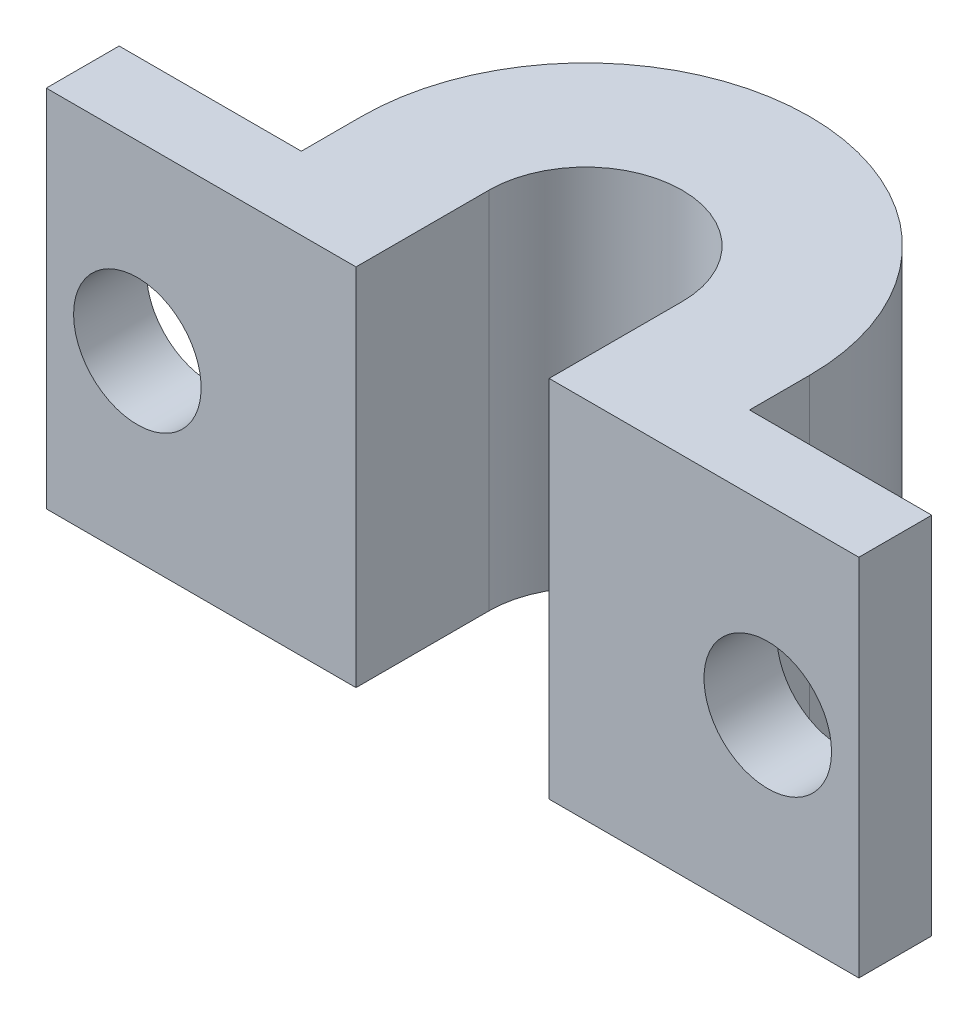
ISO-10303-21;
HEADER;
FILE_DESCRIPTION(('STEP AP214'),'2;1');
FILE_NAME('part.step','',(''),(''),'','','');
FILE_SCHEMA(('AUTOMOTIVE_DESIGN { 1 0 10303 214 1 1 1 1 }'));
ENDSEC;
DATA;
#1=APPLICATION_CONTEXT('core data for automotive mechanical design processes');
#2=APPLICATION_PROTOCOL_DEFINITION('international standard','automotive_design',2000,#1);
#3=PRODUCT_CONTEXT('',#1,'mechanical');
#4=PRODUCT('Part','Part','',(#3));
#5=PRODUCT_RELATED_PRODUCT_CATEGORY('part','',(#4));
#6=PRODUCT_DEFINITION_FORMATION('','',#4);
#7=PRODUCT_DEFINITION_CONTEXT('part definition',#1,'design');
#8=PRODUCT_DEFINITION('design','',#6,#7);
#9=PRODUCT_DEFINITION_SHAPE('','',#8);
#10=(LENGTH_UNIT() NAMED_UNIT(*) SI_UNIT(.MILLI.,.METRE.));
#11=(NAMED_UNIT(*) PLANE_ANGLE_UNIT() SI_UNIT($,.RADIAN.));
#12=(NAMED_UNIT(*) SI_UNIT($,.STERADIAN.) SOLID_ANGLE_UNIT());
#13=UNCERTAINTY_MEASURE_WITH_UNIT(LENGTH_MEASURE(1.E-05),#10,'distance_accuracy_value','');
#14=(GEOMETRIC_REPRESENTATION_CONTEXT(3) GLOBAL_UNCERTAINTY_ASSIGNED_CONTEXT((#13)) GLOBAL_UNIT_ASSIGNED_CONTEXT((#10,
#11,#12)) REPRESENTATION_CONTEXT('',''));
#15=CARTESIAN_POINT('',(0.,0.,0.));
#16=DIRECTION('',(0.,0.,1.));
#17=DIRECTION('',(1.,0.,0.));
#18=AXIS2_PLACEMENT_3D('',#15,#16,#17);
#19=CARTESIAN_POINT('',(6.15,10.,0.));
#20=DIRECTION('',(1.,0.,0.));
#21=DIRECTION('',(0.,0.,-1.));
#22=AXIS2_PLACEMENT_3D('',#19,#20,#21);
#23=PLANE('',#22);
#24=DIRECTION('',(0.,0.,1.));
#25=VECTOR('',#24,1.);
#26=CARTESIAN_POINT('',(6.15,0.,0.));
#27=LINE('',#26,#25);
#28=CARTESIAN_POINT('',(6.15,0.,0.));
#29=VERTEX_POINT('',#28);
#30=CARTESIAN_POINT('',(6.15,0.,1.65));
#31=VERTEX_POINT('',#30);
#32=EDGE_CURVE('E160',#29,#31,#27,.T.);
#33=ORIENTED_EDGE('',*,*,#32,.F.);
#34=DIRECTION('',(0.,-1.,0.));
#35=VECTOR('',#34,1.);
#36=CARTESIAN_POINT('',(6.15,10.,0.));
#37=LINE('',#36,#35);
#38=CARTESIAN_POINT('',(6.15,10.,0.));
#39=VERTEX_POINT('',#38);
#40=EDGE_CURVE('E11',#39,#29,#37,.T.);
#41=ORIENTED_EDGE('',*,*,#40,.F.);
#42=DIRECTION('',(0.,0.,1.));
#43=VECTOR('',#42,1.);
#44=CARTESIAN_POINT('',(6.15,10.,0.));
#45=LINE('',#44,#43);
#46=CARTESIAN_POINT('',(6.15,10.,1.65));
#47=VERTEX_POINT('',#46);
#48=EDGE_CURVE('E188',#39,#47,#45,.T.);
#49=ORIENTED_EDGE('',*,*,#48,.T.);
#50=DIRECTION('',(0.,-1.,0.));
#51=VECTOR('',#50,1.);
#52=CARTESIAN_POINT('',(6.15,10.,1.65));
#53=LINE('',#52,#51);
#54=EDGE_CURVE('E58',#47,#31,#53,.T.);
#55=ORIENTED_EDGE('',*,*,#54,.T.);
#56=EDGE_LOOP('',(#33,#41,#49,#55));
#57=FACE_BOUND('',#56,.T.);
#58=ADVANCED_FACE('F41',(#57),#23,.T.);
#59=CARTESIAN_POINT('',(0.,10.,0.));
#60=DIRECTION('',(0.,-1.,0.));
#61=DIRECTION('',(0.,0.,-1.));
#62=AXIS2_PLACEMENT_3D('',#59,#60,#61);
#63=CYLINDRICAL_SURFACE('',#62,6.15);
#64=CARTESIAN_POINT('',(0.,0.,0.));
#65=DIRECTION('',(0.,1.,0.));
#66=DIRECTION('',(0.,0.,1.));
#67=AXIS2_PLACEMENT_3D('',#64,#65,#66);
#68=CIRCLE('',#67,6.15);
#69=CARTESIAN_POINT('',(-6.15,0.,0.));
#70=VERTEX_POINT('',#69);
#71=EDGE_CURVE('E162',#29,#70,#68,.T.);
#72=ORIENTED_EDGE('',*,*,#71,.T.);
#73=DIRECTION('',(0.,-1.,0.));
#74=VECTOR('',#73,1.);
#75=CARTESIAN_POINT('',(-6.15,10.,0.));
#76=LINE('',#75,#74);
#77=CARTESIAN_POINT('',(-6.15,10.,0.));
#78=VERTEX_POINT('',#77);
#79=EDGE_CURVE('E50',#78,#70,#76,.T.);
#80=ORIENTED_EDGE('',*,*,#79,.F.);
#81=CARTESIAN_POINT('',(0.,10.,0.));
#82=DIRECTION('',(0.,1.,0.));
#83=DIRECTION('',(0.,0.,1.));
#84=AXIS2_PLACEMENT_3D('',#81,#82,#83);
#85=CIRCLE('',#84,6.15);
#86=EDGE_CURVE('E308',#39,#78,#85,.T.);
#87=ORIENTED_EDGE('',*,*,#86,.F.);
#88=ORIENTED_EDGE('',*,*,#40,.T.);
#89=EDGE_LOOP('',(#72,#80,#87,#88));
#90=FACE_BOUND('',#89,.T.);
#91=ADVANCED_FACE('F266',(#90),#63,.T.);
#92=CARTESIAN_POINT('',(-6.15,10.,0.));
#93=DIRECTION('',(1.,0.,0.));
#94=DIRECTION('',(0.,0.,-1.));
#95=AXIS2_PLACEMENT_3D('',#92,#93,#94);
#96=PLANE('',#95);
#97=DIRECTION('',(0.,0.,1.));
#98=VECTOR('',#97,1.);
#99=CARTESIAN_POINT('',(-6.15,0.,0.));
#100=LINE('',#99,#98);
#101=CARTESIAN_POINT('',(-6.15,0.,1.65));
#102=VERTEX_POINT('',#101);
#103=EDGE_CURVE('E164',#70,#102,#100,.T.);
#104=ORIENTED_EDGE('',*,*,#103,.T.);
#105=DIRECTION('',(0.,-1.,0.));
#106=VECTOR('',#105,1.);
#107=CARTESIAN_POINT('',(-6.15,10.,1.65));
#108=LINE('',#107,#106);
#109=CARTESIAN_POINT('',(-6.15,10.,1.65));
#110=VERTEX_POINT('',#109);
#111=EDGE_CURVE('E204',#110,#102,#108,.T.);
#112=ORIENTED_EDGE('',*,*,#111,.F.);
#113=DIRECTION('',(0.,0.,1.));
#114=VECTOR('',#113,1.);
#115=CARTESIAN_POINT('',(-6.15,10.,0.));
#116=LINE('',#115,#114);
#117=EDGE_CURVE('E214',#78,#110,#116,.T.);
#118=ORIENTED_EDGE('',*,*,#117,.F.);
#119=ORIENTED_EDGE('',*,*,#79,.T.);
#120=EDGE_LOOP('',(#104,#112,#118,#119));
#121=FACE_BOUND('',#120,.T.);
#122=ADVANCED_FACE('F212',(#121),#96,.F.);
#123=CARTESIAN_POINT('',(0.,10.,1.65));
#124=DIRECTION('',(0.,0.,1.));
#125=DIRECTION('',(1.,0.,0.));
#126=AXIS2_PLACEMENT_3D('',#123,#124,#125);
#127=PLANE('',#126);
#128=CARTESIAN_POINT('',(-8.65,5.,1.65));
#129=DIRECTION('',(0.,0.,-1.));
#130=DIRECTION('',(-1.,0.,0.));
#131=AXIS2_PLACEMENT_3D('',#128,#129,#130);
#132=CIRCLE('',#131,1.75);
#133=CARTESIAN_POINT('',(-10.4,5.,1.65));
#134=VERTEX_POINT('',#133);
#135=EDGE_CURVE('E295',#134,#134,#132,.T.);
#136=ORIENTED_EDGE('',*,*,#135,.F.);
#137=EDGE_LOOP('',(#136));
#138=FACE_BOUND('',#137,.T.);
#139=DIRECTION('',(-1.,0.,0.));
#140=VECTOR('',#139,1.);
#141=CARTESIAN_POINT('',(0.,0.,1.65));
#142=LINE('',#141,#140);
#143=CARTESIAN_POINT('',(-11.15,0.,1.65));
#144=VERTEX_POINT('',#143);
#145=EDGE_CURVE('E166',#102,#144,#142,.T.);
#146=ORIENTED_EDGE('',*,*,#145,.T.);
#147=DIRECTION('',(0.,-1.,0.));
#148=VECTOR('',#147,1.);
#149=CARTESIAN_POINT('',(-11.15,10.,1.65));
#150=LINE('',#149,#148);
#151=CARTESIAN_POINT('',(-11.15,10.,1.65));
#152=VERTEX_POINT('',#151);
#153=EDGE_CURVE('E201',#152,#144,#150,.T.);
#154=ORIENTED_EDGE('',*,*,#153,.F.);
#155=DIRECTION('',(-1.,0.,0.));
#156=VECTOR('',#155,1.);
#157=CARTESIAN_POINT('',(0.,10.,1.65));
#158=LINE('',#157,#156);
#159=EDGE_CURVE('E233',#110,#152,#158,.T.);
#160=ORIENTED_EDGE('',*,*,#159,.F.);
#161=ORIENTED_EDGE('',*,*,#111,.T.);
#162=EDGE_LOOP('',(#146,#154,#160,#161));
#163=FACE_BOUND('',#162,.T.);
#164=ADVANCED_FACE('F224',(#138,#163),#127,.F.);
#165=CARTESIAN_POINT('',(-11.15,10.,0.));
#166=DIRECTION('',(1.,0.,0.));
#167=DIRECTION('',(0.,0.,-1.));
#168=AXIS2_PLACEMENT_3D('',#165,#166,#167);
#169=PLANE('',#168);
#170=DIRECTION('',(0.,0.,1.));
#171=VECTOR('',#170,1.);
#172=CARTESIAN_POINT('',(-11.15,0.,0.));
#173=LINE('',#172,#171);
#174=CARTESIAN_POINT('',(-11.15,0.,3.65));
#175=VERTEX_POINT('',#174);
#176=EDGE_CURVE('E168',#144,#175,#173,.T.);
#177=ORIENTED_EDGE('',*,*,#176,.T.);
#178=DIRECTION('',(0.,-1.,0.));
#179=VECTOR('',#178,1.);
#180=CARTESIAN_POINT('',(-11.15,10.,3.65));
#181=LINE('',#180,#179);
#182=CARTESIAN_POINT('',(-11.15,10.,3.65));
#183=VERTEX_POINT('',#182);
#184=EDGE_CURVE('E198',#183,#175,#181,.T.);
#185=ORIENTED_EDGE('',*,*,#184,.F.);
#186=DIRECTION('',(0.,0.,1.));
#187=VECTOR('',#186,1.);
#188=CARTESIAN_POINT('',(-11.15,10.,0.));
#189=LINE('',#188,#187);
#190=EDGE_CURVE('E230',#152,#183,#189,.T.);
#191=ORIENTED_EDGE('',*,*,#190,.F.);
#192=ORIENTED_EDGE('',*,*,#153,.T.);
#193=EDGE_LOOP('',(#177,#185,#191,#192));
#194=FACE_BOUND('',#193,.T.);
#195=ADVANCED_FACE('F228',(#194),#169,.F.);
#196=CARTESIAN_POINT('',(0.,10.,3.65));
#197=DIRECTION('',(0.,0.,-1.));
#198=DIRECTION('',(-1.,0.,0.));
#199=AXIS2_PLACEMENT_3D('',#196,#197,#198);
#200=PLANE('',#199);
#201=CARTESIAN_POINT('',(-8.65,5.,3.65));
#202=DIRECTION('',(0.,0.,-1.));
#203=DIRECTION('',(-1.,0.,0.));
#204=AXIS2_PLACEMENT_3D('',#201,#202,#203);
#205=CIRCLE('',#204,1.75);
#206=CARTESIAN_POINT('',(-10.4,5.,3.65));
#207=VERTEX_POINT('',#206);
#208=EDGE_CURVE('E44',#207,#207,#205,.T.);
#209=ORIENTED_EDGE('',*,*,#208,.T.);
#210=EDGE_LOOP('',(#209));
#211=FACE_BOUND('',#210,.T.);
#212=DIRECTION('',(1.,0.,0.));
#213=VECTOR('',#212,1.);
#214=CARTESIAN_POINT('',(0.,0.,3.65));
#215=LINE('',#214,#213);
#216=CARTESIAN_POINT('',(-2.65,0.,3.65));
#217=VERTEX_POINT('',#216);
#218=EDGE_CURVE('E170',#175,#217,#215,.T.);
#219=ORIENTED_EDGE('',*,*,#218,.T.);
#220=DIRECTION('',(0.,-1.,0.));
#221=VECTOR('',#220,1.);
#222=CARTESIAN_POINT('',(-2.65,10.,3.65));
#223=LINE('',#222,#221);
#224=CARTESIAN_POINT('',(-2.65,10.,3.65));
#225=VERTEX_POINT('',#224);
#226=EDGE_CURVE('E196',#225,#217,#223,.T.);
#227=ORIENTED_EDGE('',*,*,#226,.F.);
#228=DIRECTION('',(1.,0.,0.));
#229=VECTOR('',#228,1.);
#230=CARTESIAN_POINT('',(0.,10.,3.65));
#231=LINE('',#230,#229);
#232=EDGE_CURVE('E232',#183,#225,#231,.T.);
#233=ORIENTED_EDGE('',*,*,#232,.F.);
#234=ORIENTED_EDGE('',*,*,#184,.T.);
#235=EDGE_LOOP('',(#219,#227,#233,#234));
#236=FACE_BOUND('',#235,.T.);
#237=ADVANCED_FACE('F311',(#211,#236),#200,.F.);
#238=CARTESIAN_POINT('',(-2.65,10.,0.));
#239=DIRECTION('',(1.,0.,0.));
#240=DIRECTION('',(0.,0.,-1.));
#241=AXIS2_PLACEMENT_3D('',#238,#239,#240);
#242=PLANE('',#241);
#243=DIRECTION('',(0.,0.,1.));
#244=VECTOR('',#243,1.);
#245=CARTESIAN_POINT('',(-2.65,0.,0.));
#246=LINE('',#245,#244);
#247=CARTESIAN_POINT('',(-2.65,0.,0.));
#248=VERTEX_POINT('',#247);
#249=EDGE_CURVE('E173',#248,#217,#246,.T.);
#250=ORIENTED_EDGE('',*,*,#249,.F.);
#251=DIRECTION('',(0.,-1.,0.));
#252=VECTOR('',#251,1.);
#253=CARTESIAN_POINT('',(-2.65,10.,0.));
#254=LINE('',#253,#252);
#255=CARTESIAN_POINT('',(-2.65,10.,0.));
#256=VERTEX_POINT('',#255);
#257=EDGE_CURVE('E194',#256,#248,#254,.T.);
#258=ORIENTED_EDGE('',*,*,#257,.F.);
#259=DIRECTION('',(0.,0.,1.));
#260=VECTOR('',#259,1.);
#261=CARTESIAN_POINT('',(-2.65,10.,0.));
#262=LINE('',#261,#260);
#263=EDGE_CURVE('E235',#256,#225,#262,.T.);
#264=ORIENTED_EDGE('',*,*,#263,.T.);
#265=ORIENTED_EDGE('',*,*,#226,.T.);
#266=EDGE_LOOP('',(#250,#258,#264,#265));
#267=FACE_BOUND('',#266,.T.);
#268=ADVANCED_FACE('F251',(#267),#242,.T.);
#269=CARTESIAN_POINT('',(0.,10.,0.));
#270=DIRECTION('',(0.,-1.,0.));
#271=DIRECTION('',(0.,0.,-1.));
#272=AXIS2_PLACEMENT_3D('',#269,#270,#271);
#273=CYLINDRICAL_SURFACE('',#272,2.65);
#274=CARTESIAN_POINT('',(0.,0.,0.));
#275=DIRECTION('',(0.,1.,0.));
#276=DIRECTION('',(0.,0.,1.));
#277=AXIS2_PLACEMENT_3D('',#274,#275,#276);
#278=CIRCLE('',#277,2.65);
#279=CARTESIAN_POINT('',(2.65,0.,0.));
#280=VERTEX_POINT('',#279);
#281=EDGE_CURVE('E176',#280,#248,#278,.T.);
#282=ORIENTED_EDGE('',*,*,#281,.F.);
#283=DIRECTION('',(0.,-1.,0.));
#284=VECTOR('',#283,1.);
#285=CARTESIAN_POINT('',(2.65,10.,0.));
#286=LINE('',#285,#284);
#287=CARTESIAN_POINT('',(2.65,10.,0.));
#288=VERTEX_POINT('',#287);
#289=EDGE_CURVE('E192',#288,#280,#286,.T.);
#290=ORIENTED_EDGE('',*,*,#289,.F.);
#291=CARTESIAN_POINT('',(0.,10.,0.));
#292=DIRECTION('',(0.,1.,0.));
#293=DIRECTION('',(0.,0.,1.));
#294=AXIS2_PLACEMENT_3D('',#291,#292,#293);
#295=CIRCLE('',#294,2.65);
#296=EDGE_CURVE('E242',#288,#256,#295,.T.);
#297=ORIENTED_EDGE('',*,*,#296,.T.);
#298=ORIENTED_EDGE('',*,*,#257,.T.);
#299=EDGE_LOOP('',(#282,#290,#297,#298));
#300=FACE_BOUND('',#299,.T.);
#301=ADVANCED_FACE('F246',(#300),#273,.F.);
#302=CARTESIAN_POINT('',(2.65,10.,0.));
#303=DIRECTION('',(1.,0.,0.));
#304=DIRECTION('',(0.,0.,-1.));
#305=AXIS2_PLACEMENT_3D('',#302,#303,#304);
#306=PLANE('',#305);
#307=DIRECTION('',(0.,0.,1.));
#308=VECTOR('',#307,1.);
#309=CARTESIAN_POINT('',(2.65,0.,0.));
#310=LINE('',#309,#308);
#311=CARTESIAN_POINT('',(2.65,0.,3.65));
#312=VERTEX_POINT('',#311);
#313=EDGE_CURVE('E179',#280,#312,#310,.T.);
#314=ORIENTED_EDGE('',*,*,#313,.T.);
#315=DIRECTION('',(0.,-1.,0.));
#316=VECTOR('',#315,1.);
#317=CARTESIAN_POINT('',(2.65,10.,3.65));
#318=LINE('',#317,#316);
#319=CARTESIAN_POINT('',(2.65,10.,3.65));
#320=VERTEX_POINT('',#319);
#321=EDGE_CURVE('E141',#320,#312,#318,.T.);
#322=ORIENTED_EDGE('',*,*,#321,.F.);
#323=DIRECTION('',(0.,0.,1.));
#324=VECTOR('',#323,1.);
#325=CARTESIAN_POINT('',(2.65,10.,0.));
#326=LINE('',#325,#324);
#327=EDGE_CURVE('E151',#288,#320,#326,.T.);
#328=ORIENTED_EDGE('',*,*,#327,.F.);
#329=ORIENTED_EDGE('',*,*,#289,.T.);
#330=EDGE_LOOP('',(#314,#322,#328,#329));
#331=FACE_BOUND('',#330,.T.);
#332=ADVANCED_FACE('F254',(#331),#306,.F.);
#333=CARTESIAN_POINT('',(0.,10.,3.65));
#334=DIRECTION('',(0.,0.,1.));
#335=DIRECTION('',(1.,0.,0.));
#336=AXIS2_PLACEMENT_3D('',#333,#334,#335);
#337=PLANE('',#336);
#338=CARTESIAN_POINT('',(8.65,5.,3.65));
#339=DIRECTION('',(0.,0.,1.));
#340=DIRECTION('',(1.,0.,0.));
#341=AXIS2_PLACEMENT_3D('',#338,#339,#340);
#342=CIRCLE('',#341,1.75);
#343=CARTESIAN_POINT('',(10.4,5.,3.65));
#344=VERTEX_POINT('',#343);
#345=EDGE_CURVE('E299',#344,#344,#342,.T.);
#346=ORIENTED_EDGE('',*,*,#345,.F.);
#347=EDGE_LOOP('',(#346));
#348=FACE_BOUND('',#347,.T.);
#349=DIRECTION('',(-1.,0.,0.));
#350=VECTOR('',#349,1.);
#351=CARTESIAN_POINT('',(0.,0.,3.65));
#352=LINE('',#351,#350);
#353=CARTESIAN_POINT('',(11.15,0.,3.65));
#354=VERTEX_POINT('',#353);
#355=EDGE_CURVE('E137',#354,#312,#352,.T.);
#356=ORIENTED_EDGE('',*,*,#355,.F.);
#357=DIRECTION('',(0.,-1.,0.));
#358=VECTOR('',#357,1.);
#359=CARTESIAN_POINT('',(11.15,10.,3.65));
#360=LINE('',#359,#358);
#361=CARTESIAN_POINT('',(11.15,10.,3.65));
#362=VERTEX_POINT('',#361);
#363=EDGE_CURVE('E132',#362,#354,#360,.T.);
#364=ORIENTED_EDGE('',*,*,#363,.F.);
#365=DIRECTION('',(-1.,0.,0.));
#366=VECTOR('',#365,1.);
#367=CARTESIAN_POINT('',(0.,10.,3.65));
#368=LINE('',#367,#366);
#369=EDGE_CURVE('E135',#362,#320,#368,.T.);
#370=ORIENTED_EDGE('',*,*,#369,.T.);
#371=ORIENTED_EDGE('',*,*,#321,.T.);
#372=EDGE_LOOP('',(#356,#364,#370,#371));
#373=FACE_BOUND('',#372,.T.);
#374=ADVANCED_FACE('F134',(#348,#373),#337,.T.);
#375=CARTESIAN_POINT('',(11.15,10.,0.));
#376=DIRECTION('',(1.,0.,0.));
#377=DIRECTION('',(0.,0.,-1.));
#378=AXIS2_PLACEMENT_3D('',#375,#376,#377);
#379=PLANE('',#378);
#380=DIRECTION('',(0.,0.,1.));
#381=VECTOR('',#380,1.);
#382=CARTESIAN_POINT('',(11.15,0.,0.));
#383=LINE('',#382,#381);
#384=CARTESIAN_POINT('',(11.15,0.,1.65));
#385=VERTEX_POINT('',#384);
#386=EDGE_CURVE('E183',#385,#354,#383,.T.);
#387=ORIENTED_EDGE('',*,*,#386,.F.);
#388=DIRECTION('',(0.,-1.,0.));
#389=VECTOR('',#388,1.);
#390=CARTESIAN_POINT('',(11.15,10.,1.65));
#391=LINE('',#390,#389);
#392=CARTESIAN_POINT('',(11.15,10.,1.65));
#393=VERTEX_POINT('',#392);
#394=EDGE_CURVE('E95',#393,#385,#391,.T.);
#395=ORIENTED_EDGE('',*,*,#394,.F.);
#396=DIRECTION('',(0.,0.,1.));
#397=VECTOR('',#396,1.);
#398=CARTESIAN_POINT('',(11.15,10.,0.));
#399=LINE('',#398,#397);
#400=EDGE_CURVE('E148',#393,#362,#399,.T.);
#401=ORIENTED_EDGE('',*,*,#400,.T.);
#402=ORIENTED_EDGE('',*,*,#363,.T.);
#403=EDGE_LOOP('',(#387,#395,#401,#402));
#404=FACE_BOUND('',#403,.T.);
#405=ADVANCED_FACE('F154',(#404),#379,.T.);
#406=CARTESIAN_POINT('',(0.,10.,1.65));
#407=DIRECTION('',(0.,0.,-1.));
#408=DIRECTION('',(-1.,0.,0.));
#409=AXIS2_PLACEMENT_3D('',#406,#407,#408);
#410=PLANE('',#409);
#411=CARTESIAN_POINT('',(8.65,5.,1.65));
#412=DIRECTION('',(0.,0.,-1.));
#413=DIRECTION('',(1.,0.,0.));
#414=AXIS2_PLACEMENT_3D('',#411,#412,#413);
#415=CIRCLE('',#414,1.75);
#416=CARTESIAN_POINT('',(10.4,5.,1.65));
#417=VERTEX_POINT('',#416);
#418=EDGE_CURVE('E303',#417,#417,#415,.T.);
#419=ORIENTED_EDGE('',*,*,#418,.F.);
#420=EDGE_LOOP('',(#419));
#421=FACE_BOUND('',#420,.T.);
#422=DIRECTION('',(1.,0.,0.));
#423=VECTOR('',#422,1.);
#424=CARTESIAN_POINT('',(0.,0.,1.65));
#425=LINE('',#424,#423);
#426=EDGE_CURVE('E185',#31,#385,#425,.T.);
#427=ORIENTED_EDGE('',*,*,#426,.F.);
#428=ORIENTED_EDGE('',*,*,#54,.F.);
#429=DIRECTION('',(1.,0.,0.));
#430=VECTOR('',#429,1.);
#431=CARTESIAN_POINT('',(0.,10.,1.65));
#432=LINE('',#431,#430);
#433=EDGE_CURVE('E155',#47,#393,#432,.T.);
#434=ORIENTED_EDGE('',*,*,#433,.T.);
#435=ORIENTED_EDGE('',*,*,#394,.T.);
#436=EDGE_LOOP('',(#427,#428,#434,#435));
#437=FACE_BOUND('',#436,.T.);
#438=ADVANCED_FACE('F270',(#421,#437),#410,.T.);
#439=CARTESIAN_POINT('',(0.,10.,0.));
#440=DIRECTION('',(0.,1.,0.));
#441=DIRECTION('',(0.,0.,1.));
#442=AXIS2_PLACEMENT_3D('',#439,#440,#441);
#443=PLANE('',#442);
#444=ORIENTED_EDGE('',*,*,#48,.F.);
#445=ORIENTED_EDGE('',*,*,#86,.T.);
#446=ORIENTED_EDGE('',*,*,#117,.T.);
#447=ORIENTED_EDGE('',*,*,#159,.T.);
#448=ORIENTED_EDGE('',*,*,#190,.T.);
#449=ORIENTED_EDGE('',*,*,#232,.T.);
#450=ORIENTED_EDGE('',*,*,#263,.F.);
#451=ORIENTED_EDGE('',*,*,#296,.F.);
#452=ORIENTED_EDGE('',*,*,#327,.T.);
#453=ORIENTED_EDGE('',*,*,#369,.F.);
#454=ORIENTED_EDGE('',*,*,#400,.F.);
#455=ORIENTED_EDGE('',*,*,#433,.F.);
#456=EDGE_LOOP('',(#444,#445,#446,#447,#448,#449,#450,#451,#452,#453,#454,#455));
#457=FACE_BOUND('',#456,.T.);
#458=ADVANCED_FACE('F146',(#457),#443,.T.);
#459=CARTESIAN_POINT('',(0.,0.,0.));
#460=DIRECTION('',(0.,1.,0.));
#461=DIRECTION('',(0.,0.,1.));
#462=AXIS2_PLACEMENT_3D('',#459,#460,#461);
#463=PLANE('',#462);
#464=ORIENTED_EDGE('',*,*,#32,.T.);
#465=ORIENTED_EDGE('',*,*,#426,.T.);
#466=ORIENTED_EDGE('',*,*,#386,.T.);
#467=ORIENTED_EDGE('',*,*,#355,.T.);
#468=ORIENTED_EDGE('',*,*,#313,.F.);
#469=ORIENTED_EDGE('',*,*,#281,.T.);
#470=ORIENTED_EDGE('',*,*,#249,.T.);
#471=ORIENTED_EDGE('',*,*,#218,.F.);
#472=ORIENTED_EDGE('',*,*,#176,.F.);
#473=ORIENTED_EDGE('',*,*,#145,.F.);
#474=ORIENTED_EDGE('',*,*,#103,.F.);
#475=ORIENTED_EDGE('',*,*,#71,.F.);
#476=EDGE_LOOP('',(#464,#465,#466,#467,#468,#469,#470,#471,#472,#473,#474,#475));
#477=FACE_BOUND('',#476,.T.);
#478=ADVANCED_FACE('F219',(#477),#463,.F.);
#479=CARTESIAN_POINT('',(8.65,5.,11.65));
#480=DIRECTION('',(0.,0.,-1.));
#481=DIRECTION('',(-1.,0.,0.));
#482=AXIS2_PLACEMENT_3D('',#479,#480,#481);
#483=CYLINDRICAL_SURFACE('',#482,1.75);
#484=ORIENTED_EDGE('',*,*,#345,.T.);
#485=EDGE_LOOP('',(#484));
#486=FACE_BOUND('',#485,.T.);
#487=ORIENTED_EDGE('',*,*,#418,.T.);
#488=EDGE_LOOP('',(#487));
#489=FACE_BOUND('',#488,.T.);
#490=ADVANCED_FACE('F283',(#486,#489),#483,.F.);
#491=CARTESIAN_POINT('',(-8.65,5.,11.65));
#492=DIRECTION('',(0.,0.,-1.));
#493=DIRECTION('',(-1.,0.,0.));
#494=AXIS2_PLACEMENT_3D('',#491,#492,#493);
#495=CYLINDRICAL_SURFACE('',#494,1.75);
#496=ORIENTED_EDGE('',*,*,#135,.T.);
#497=EDGE_LOOP('',(#496));
#498=FACE_BOUND('',#497,.T.);
#499=ORIENTED_EDGE('',*,*,#208,.F.);
#500=EDGE_LOOP('',(#499));
#501=FACE_BOUND('',#500,.T.);
#502=ADVANCED_FACE('F286',(#498,#501),#495,.F.);
#503=CLOSED_SHELL('',(#58,#91,#122,#164,#195,#237,#268,#301,#332,#374,#405,#438,#458,#478,#490,#502));
#504=MANIFOLD_SOLID_BREP('B2',#503);
#505=ADVANCED_BREP_SHAPE_REPRESENTATION('',(#18,#504),#14);
#506=SHAPE_DEFINITION_REPRESENTATION(#9,#505);
ENDSEC;
END-ISO-10303-21;
